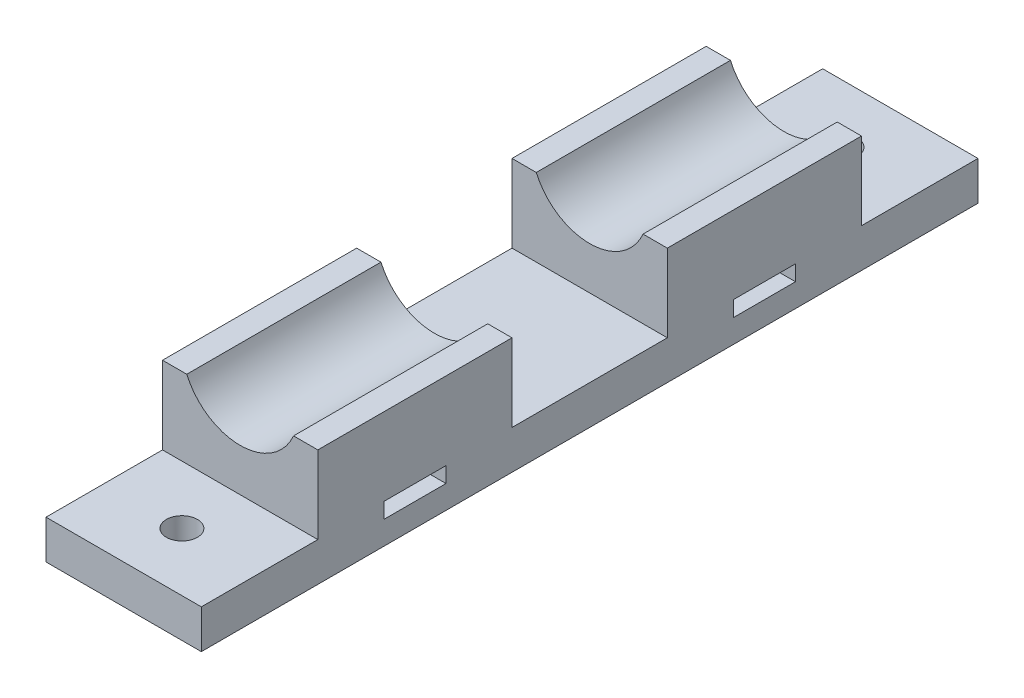
ISO-10303-21;
HEADER;
FILE_DESCRIPTION(('STEP AP214'),'2;1');
FILE_NAME('part.step','',(''),(''),'','','');
FILE_SCHEMA(('AUTOMOTIVE_DESIGN { 1 0 10303 214 1 1 1 1 }'));
ENDSEC;
DATA;
#1=APPLICATION_CONTEXT('core data for automotive mechanical design processes');
#2=APPLICATION_PROTOCOL_DEFINITION('international standard','automotive_design',2000,#1);
#3=PRODUCT_CONTEXT('',#1,'mechanical');
#4=PRODUCT('Part','Part','',(#3));
#5=PRODUCT_RELATED_PRODUCT_CATEGORY('part','',(#4));
#6=PRODUCT_DEFINITION_FORMATION('','',#4);
#7=PRODUCT_DEFINITION_CONTEXT('part definition',#1,'design');
#8=PRODUCT_DEFINITION('design','',#6,#7);
#9=PRODUCT_DEFINITION_SHAPE('','',#8);
#10=(LENGTH_UNIT() NAMED_UNIT(*) SI_UNIT(.MILLI.,.METRE.));
#11=(NAMED_UNIT(*) PLANE_ANGLE_UNIT() SI_UNIT($,.RADIAN.));
#12=(NAMED_UNIT(*) SI_UNIT($,.STERADIAN.) SOLID_ANGLE_UNIT());
#13=UNCERTAINTY_MEASURE_WITH_UNIT(LENGTH_MEASURE(1.E-05),#10,'distance_accuracy_value','');
#14=(GEOMETRIC_REPRESENTATION_CONTEXT(3) GLOBAL_UNCERTAINTY_ASSIGNED_CONTEXT((#13)) GLOBAL_UNIT_ASSIGNED_CONTEXT((#10,
#11,#12)) REPRESENTATION_CONTEXT('',''));
#15=CARTESIAN_POINT('',(0.,0.,0.));
#16=DIRECTION('',(0.,0.,1.));
#17=DIRECTION('',(1.,0.,0.));
#18=AXIS2_PLACEMENT_3D('',#15,#16,#17);
#19=CARTESIAN_POINT('',(10.,18.,35.));
#20=DIRECTION('',(0.,0.,-1.));
#21=DIRECTION('',(-1.,0.,0.));
#22=AXIS2_PLACEMENT_3D('',#19,#20,#21);
#23=PLANE('',#22);
#24=DIRECTION('',(-1.,0.,0.));
#25=VECTOR('',#24,1.);
#26=CARTESIAN_POINT('',(-10.,5.,35.));
#27=LINE('',#26,#25);
#28=CARTESIAN_POINT('',(10.,5.,35.));
#29=VERTEX_POINT('',#28);
#30=CARTESIAN_POINT('',(-10.,5.,35.));
#31=VERTEX_POINT('',#30);
#32=EDGE_CURVE('E47',#29,#31,#27,.T.);
#33=ORIENTED_EDGE('',*,*,#32,.F.);
#34=DIRECTION('',(0.,-1.,0.));
#35=VECTOR('',#34,1.);
#36=CARTESIAN_POINT('',(10.,18.,35.));
#37=LINE('',#36,#35);
#38=CARTESIAN_POINT('',(10.,15.,35.));
#39=VERTEX_POINT('',#38);
#40=EDGE_CURVE('E354',#39,#29,#37,.T.);
#41=ORIENTED_EDGE('',*,*,#40,.F.);
#42=DIRECTION('',(1.,0.,0.));
#43=VECTOR('',#42,1.);
#44=CARTESIAN_POINT('',(6.87386354243376,15.,35.));
#45=LINE('',#44,#43);
#46=CARTESIAN_POINT('',(6.87386354243376,15.,35.));
#47=VERTEX_POINT('',#46);
#48=EDGE_CURVE('E266',#47,#39,#45,.T.);
#49=ORIENTED_EDGE('',*,*,#48,.F.);
#50=CARTESIAN_POINT('',(0.,18.,35.));
#51=DIRECTION('',(0.,0.,1.));
#52=DIRECTION('',(1.,0.,0.));
#53=AXIS2_PLACEMENT_3D('',#50,#51,#52);
#54=CIRCLE('',#53,7.5);
#55=CARTESIAN_POINT('',(-6.87386354243376,15.,35.));
#56=VERTEX_POINT('',#55);
#57=EDGE_CURVE('E263',#56,#47,#54,.T.);
#58=ORIENTED_EDGE('',*,*,#57,.F.);
#59=DIRECTION('',(1.,0.,0.));
#60=VECTOR('',#59,1.);
#61=CARTESIAN_POINT('',(-10.,15.,35.));
#62=LINE('',#61,#60);
#63=CARTESIAN_POINT('',(-10.,15.,35.));
#64=VERTEX_POINT('',#63);
#65=EDGE_CURVE('E197',#64,#56,#62,.T.);
#66=ORIENTED_EDGE('',*,*,#65,.F.);
#67=DIRECTION('',(0.,-1.,0.));
#68=VECTOR('',#67,1.);
#69=CARTESIAN_POINT('',(-10.,18.,35.));
#70=LINE('',#69,#68);
#71=EDGE_CURVE('E193',#64,#31,#70,.T.);
#72=ORIENTED_EDGE('',*,*,#71,.T.);
#73=EDGE_LOOP('',(#33,#41,#49,#58,#66,#72));
#74=FACE_BOUND('',#73,.T.);
#75=ADVANCED_FACE('F33',(#74),#23,.F.);
#76=CARTESIAN_POINT('',(10.,18.,-35.));
#77=DIRECTION('',(0.,0.,1.));
#78=DIRECTION('',(1.,0.,0.));
#79=AXIS2_PLACEMENT_3D('',#76,#77,#78);
#80=PLANE('',#79);
#81=DIRECTION('',(1.,0.,0.));
#82=VECTOR('',#81,1.);
#83=CARTESIAN_POINT('',(-10.,5.,-35.));
#84=LINE('',#83,#82);
#85=CARTESIAN_POINT('',(-10.,5.,-35.));
#86=VERTEX_POINT('',#85);
#87=CARTESIAN_POINT('',(10.,5.,-35.));
#88=VERTEX_POINT('',#87);
#89=EDGE_CURVE('E55',#86,#88,#84,.T.);
#90=ORIENTED_EDGE('',*,*,#89,.F.);
#91=DIRECTION('',(0.,1.,0.));
#92=VECTOR('',#91,1.);
#93=CARTESIAN_POINT('',(-10.,18.,-35.));
#94=LINE('',#93,#92);
#95=CARTESIAN_POINT('',(-10.,15.,-35.));
#96=VERTEX_POINT('',#95);
#97=EDGE_CURVE('E370',#86,#96,#94,.T.);
#98=ORIENTED_EDGE('',*,*,#97,.T.);
#99=DIRECTION('',(-1.,0.,0.));
#100=VECTOR('',#99,1.);
#101=CARTESIAN_POINT('',(-10.,15.,-35.));
#102=LINE('',#101,#100);
#103=CARTESIAN_POINT('',(-6.87386354243376,15.,-35.));
#104=VERTEX_POINT('',#103);
#105=EDGE_CURVE('E261',#104,#96,#102,.T.);
#106=ORIENTED_EDGE('',*,*,#105,.F.);
#107=CARTESIAN_POINT('',(0.,18.,-35.));
#108=DIRECTION('',(0.,0.,1.));
#109=DIRECTION('',(1.,0.,0.));
#110=AXIS2_PLACEMENT_3D('',#107,#108,#109);
#111=CIRCLE('',#110,7.5);
#112=CARTESIAN_POINT('',(6.87386354243376,15.,-35.));
#113=VERTEX_POINT('',#112);
#114=EDGE_CURVE('E256',#113,#104,#111,.F.);
#115=ORIENTED_EDGE('',*,*,#114,.F.);
#116=DIRECTION('',(-1.,0.,0.));
#117=VECTOR('',#116,1.);
#118=CARTESIAN_POINT('',(6.87386354243376,15.,-35.));
#119=LINE('',#118,#117);
#120=CARTESIAN_POINT('',(10.,15.,-35.));
#121=VERTEX_POINT('',#120);
#122=EDGE_CURVE('E258',#121,#113,#119,.T.);
#123=ORIENTED_EDGE('',*,*,#122,.F.);
#124=DIRECTION('',(0.,1.,0.));
#125=VECTOR('',#124,1.);
#126=CARTESIAN_POINT('',(10.,18.,-35.));
#127=LINE('',#126,#125);
#128=EDGE_CURVE('E359',#88,#121,#127,.T.);
#129=ORIENTED_EDGE('',*,*,#128,.F.);
#130=EDGE_LOOP('',(#90,#98,#106,#115,#123,#129));
#131=FACE_BOUND('',#130,.T.);
#132=ADVANCED_FACE('F425',(#131),#80,.F.);
#133=CARTESIAN_POINT('',(10.,0.,0.));
#134=DIRECTION('',(1.,0.,0.));
#135=DIRECTION('',(0.,0.,-1.));
#136=AXIS2_PLACEMENT_3D('',#133,#134,#135);
#137=PLANE('',#136);
#138=DIRECTION('',(0.,0.,1.));
#139=VECTOR('',#138,1.);
#140=CARTESIAN_POINT('',(10.,15.,-56.3600093632938));
#141=LINE('',#140,#139);
#142=CARTESIAN_POINT('',(10.,15.,9.99999999999999));
#143=VERTEX_POINT('',#142);
#144=EDGE_CURVE('E271',#143,#39,#141,.T.);
#145=ORIENTED_EDGE('',*,*,#144,.T.);
#146=ORIENTED_EDGE('',*,*,#40,.T.);
#147=DIRECTION('',(0.,0.,-1.));
#148=VECTOR('',#147,1.);
#149=CARTESIAN_POINT('',(10.,5.,35.));
#150=LINE('',#149,#148);
#151=CARTESIAN_POINT('',(10.,4.99999999999999,50.));
#152=VERTEX_POINT('',#151);
#153=EDGE_CURVE('E217',#152,#29,#150,.T.);
#154=ORIENTED_EDGE('',*,*,#153,.F.);
#155=DIRECTION('',(0.,1.,0.));
#156=VECTOR('',#155,1.);
#157=CARTESIAN_POINT('',(10.,-25.,50.));
#158=LINE('',#157,#156);
#159=CARTESIAN_POINT('',(10.,0.,50.));
#160=VERTEX_POINT('',#159);
#161=EDGE_CURVE('E226',#160,#152,#158,.T.);
#162=ORIENTED_EDGE('',*,*,#161,.F.);
#163=DIRECTION('',(0.,0.,-1.));
#164=VECTOR('',#163,1.);
#165=CARTESIAN_POINT('',(10.,0.,35.));
#166=LINE('',#165,#164);
#167=CARTESIAN_POINT('',(10.,0.,-50.));
#168=VERTEX_POINT('',#167);
#169=EDGE_CURVE('E356',#160,#168,#166,.T.);
#170=ORIENTED_EDGE('',*,*,#169,.T.);
#171=DIRECTION('',(0.,1.,0.));
#172=VECTOR('',#171,1.);
#173=CARTESIAN_POINT('',(10.,-25.,-50.));
#174=LINE('',#173,#172);
#175=CARTESIAN_POINT('',(10.,5.00000000000001,-50.));
#176=VERTEX_POINT('',#175);
#177=EDGE_CURVE('E251',#168,#176,#174,.T.);
#178=ORIENTED_EDGE('',*,*,#177,.T.);
#179=DIRECTION('',(0.,0.,-1.));
#180=VECTOR('',#179,1.);
#181=CARTESIAN_POINT('',(10.,5.,-35.));
#182=LINE('',#181,#180);
#183=EDGE_CURVE('E245',#88,#176,#182,.T.);
#184=ORIENTED_EDGE('',*,*,#183,.F.);
#185=ORIENTED_EDGE('',*,*,#128,.T.);
#186=CARTESIAN_POINT('',(10.,15.,-9.99999999999999));
#187=VERTEX_POINT('',#186);
#188=EDGE_CURVE('E259',#121,#187,#141,.T.);
#189=ORIENTED_EDGE('',*,*,#188,.T.);
#190=DIRECTION('',(0.,-1.,0.));
#191=VECTOR('',#190,1.);
#192=CARTESIAN_POINT('',(10.,18.,-9.99999999999999));
#193=LINE('',#192,#191);
#194=CARTESIAN_POINT('',(10.,5.,-10.));
#195=VERTEX_POINT('',#194);
#196=EDGE_CURVE('E361',#187,#195,#193,.T.);
#197=ORIENTED_EDGE('',*,*,#196,.T.);
#198=DIRECTION('',(0.,0.,1.));
#199=VECTOR('',#198,1.);
#200=CARTESIAN_POINT('',(10.,5.,10.));
#201=LINE('',#200,#199);
#202=CARTESIAN_POINT('',(10.,5.,10.));
#203=VERTEX_POINT('',#202);
#204=EDGE_CURVE('E363',#195,#203,#201,.T.);
#205=ORIENTED_EDGE('',*,*,#204,.T.);
#206=DIRECTION('',(0.,1.,0.));
#207=VECTOR('',#206,1.);
#208=CARTESIAN_POINT('',(10.,18.,9.99999999999999));
#209=LINE('',#208,#207);
#210=EDGE_CURVE('E365',#203,#143,#209,.T.);
#211=ORIENTED_EDGE('',*,*,#210,.T.);
#212=EDGE_LOOP('',(#145,#146,#154,#162,#170,#178,#184,#185,#189,#197,#205,#211));
#213=FACE_BOUND('',#212,.T.);
#214=DIRECTION('',(0.,0.,-1.));
#215=VECTOR('',#214,1.);
#216=CARTESIAN_POINT('',(10.,3.,-18.5));
#217=LINE('',#216,#215);
#218=CARTESIAN_POINT('',(10.,3.,-18.5));
#219=VERTEX_POINT('',#218);
#220=CARTESIAN_POINT('',(10.,3.00000000000001,-26.5));
#221=VERTEX_POINT('',#220);
#222=EDGE_CURVE('E327',#219,#221,#217,.T.);
#223=ORIENTED_EDGE('',*,*,#222,.F.);
#224=DIRECTION('',(0.,-1.,0.));
#225=VECTOR('',#224,1.);
#226=CARTESIAN_POINT('',(10.,5.00000000000001,-18.5));
#227=LINE('',#226,#225);
#228=CARTESIAN_POINT('',(10.,5.00000000000001,-18.5));
#229=VERTEX_POINT('',#228);
#230=EDGE_CURVE('E325',#229,#219,#227,.T.);
#231=ORIENTED_EDGE('',*,*,#230,.F.);
#232=DIRECTION('',(0.,0.,1.));
#233=VECTOR('',#232,1.);
#234=CARTESIAN_POINT('',(10.,5.00000000000001,-18.5));
#235=LINE('',#234,#233);
#236=CARTESIAN_POINT('',(10.,5.00000000000001,-26.5));
#237=VERTEX_POINT('',#236);
#238=EDGE_CURVE('E333',#237,#229,#235,.T.);
#239=ORIENTED_EDGE('',*,*,#238,.F.);
#240=DIRECTION('',(0.,1.,0.));
#241=VECTOR('',#240,1.);
#242=CARTESIAN_POINT('',(10.,5.00000000000001,-26.5));
#243=LINE('',#242,#241);
#244=EDGE_CURVE('E330',#221,#237,#243,.T.);
#245=ORIENTED_EDGE('',*,*,#244,.F.);
#246=EDGE_LOOP('',(#223,#231,#239,#245));
#247=FACE_BOUND('',#246,.T.);
#248=DIRECTION('',(0.,0.,-1.));
#249=VECTOR('',#248,1.);
#250=CARTESIAN_POINT('',(10.,3.,18.5));
#251=LINE('',#250,#249);
#252=CARTESIAN_POINT('',(10.,3.,26.5));
#253=VERTEX_POINT('',#252);
#254=CARTESIAN_POINT('',(10.,3.,18.5));
#255=VERTEX_POINT('',#254);
#256=EDGE_CURVE('E296',#253,#255,#251,.T.);
#257=ORIENTED_EDGE('',*,*,#256,.F.);
#258=DIRECTION('',(0.,-1.,0.));
#259=VECTOR('',#258,1.);
#260=CARTESIAN_POINT('',(10.,5.,26.5));
#261=LINE('',#260,#259);
#262=CARTESIAN_POINT('',(10.,5.,26.5));
#263=VERTEX_POINT('',#262);
#264=EDGE_CURVE('E294',#263,#253,#261,.T.);
#265=ORIENTED_EDGE('',*,*,#264,.F.);
#266=DIRECTION('',(0.,0.,1.));
#267=VECTOR('',#266,1.);
#268=CARTESIAN_POINT('',(10.,5.,18.5));
#269=LINE('',#268,#267);
#270=CARTESIAN_POINT('',(10.,5.,18.5));
#271=VERTEX_POINT('',#270);
#272=EDGE_CURVE('E302',#271,#263,#269,.T.);
#273=ORIENTED_EDGE('',*,*,#272,.F.);
#274=DIRECTION('',(0.,1.,0.));
#275=VECTOR('',#274,1.);
#276=CARTESIAN_POINT('',(10.,5.,18.5));
#277=LINE('',#276,#275);
#278=EDGE_CURVE('E299',#255,#271,#277,.T.);
#279=ORIENTED_EDGE('',*,*,#278,.F.);
#280=EDGE_LOOP('',(#257,#265,#273,#279));
#281=FACE_BOUND('',#280,.T.);
#282=ADVANCED_FACE('F398',(#213,#247,#281),#137,.T.);
#283=CARTESIAN_POINT('',(-10.,0.,0.));
#284=DIRECTION('',(1.,0.,0.));
#285=DIRECTION('',(0.,0.,-1.));
#286=AXIS2_PLACEMENT_3D('',#283,#284,#285);
#287=PLANE('',#286);
#288=DIRECTION('',(0.,-1.,0.));
#289=VECTOR('',#288,1.);
#290=CARTESIAN_POINT('',(-10.,5.00000000000001,-18.5));
#291=LINE('',#290,#289);
#292=CARTESIAN_POINT('',(-10.,5.00000000000001,-18.5));
#293=VERTEX_POINT('',#292);
#294=CARTESIAN_POINT('',(-10.,3.,-18.5));
#295=VERTEX_POINT('',#294);
#296=EDGE_CURVE('E324',#293,#295,#291,.T.);
#297=ORIENTED_EDGE('',*,*,#296,.T.);
#298=DIRECTION('',(0.,0.,-1.));
#299=VECTOR('',#298,1.);
#300=CARTESIAN_POINT('',(-10.,3.,-18.5));
#301=LINE('',#300,#299);
#302=CARTESIAN_POINT('',(-10.,3.00000000000001,-26.5));
#303=VERTEX_POINT('',#302);
#304=EDGE_CURVE('E338',#295,#303,#301,.T.);
#305=ORIENTED_EDGE('',*,*,#304,.T.);
#306=DIRECTION('',(0.,1.,0.));
#307=VECTOR('',#306,1.);
#308=CARTESIAN_POINT('',(-10.,5.00000000000001,-26.5));
#309=LINE('',#308,#307);
#310=CARTESIAN_POINT('',(-10.,5.00000000000001,-26.5));
#311=VERTEX_POINT('',#310);
#312=EDGE_CURVE('E341',#303,#311,#309,.T.);
#313=ORIENTED_EDGE('',*,*,#312,.T.);
#314=DIRECTION('',(0.,0.,1.));
#315=VECTOR('',#314,1.);
#316=CARTESIAN_POINT('',(-10.,5.00000000000001,-18.5));
#317=LINE('',#316,#315);
#318=EDGE_CURVE('E328',#311,#293,#317,.T.);
#319=ORIENTED_EDGE('',*,*,#318,.T.);
#320=EDGE_LOOP('',(#297,#305,#313,#319));
#321=FACE_BOUND('',#320,.T.);
#322=ORIENTED_EDGE('',*,*,#71,.F.);
#323=DIRECTION('',(0.,0.,1.));
#324=VECTOR('',#323,1.);
#325=CARTESIAN_POINT('',(-10.,15.,-56.3600093632938));
#326=LINE('',#325,#324);
#327=CARTESIAN_POINT('',(-10.,15.,9.99999999999999));
#328=VERTEX_POINT('',#327);
#329=EDGE_CURVE('E268',#328,#64,#326,.T.);
#330=ORIENTED_EDGE('',*,*,#329,.F.);
#331=DIRECTION('',(0.,1.,0.));
#332=VECTOR('',#331,1.);
#333=CARTESIAN_POINT('',(-10.,18.,9.99999999999999));
#334=LINE('',#333,#332);
#335=CARTESIAN_POINT('',(-10.,5.,10.));
#336=VERTEX_POINT('',#335);
#337=EDGE_CURVE('E357',#336,#328,#334,.T.);
#338=ORIENTED_EDGE('',*,*,#337,.F.);
#339=DIRECTION('',(0.,0.,1.));
#340=VECTOR('',#339,1.);
#341=CARTESIAN_POINT('',(-10.,5.,10.));
#342=LINE('',#341,#340);
#343=CARTESIAN_POINT('',(-10.,5.,-10.));
#344=VERTEX_POINT('',#343);
#345=EDGE_CURVE('E374',#344,#336,#342,.T.);
#346=ORIENTED_EDGE('',*,*,#345,.F.);
#347=DIRECTION('',(0.,-1.,0.));
#348=VECTOR('',#347,1.);
#349=CARTESIAN_POINT('',(-10.,18.,-9.99999999999999));
#350=LINE('',#349,#348);
#351=CARTESIAN_POINT('',(-10.,15.,-10.));
#352=VERTEX_POINT('',#351);
#353=EDGE_CURVE('E372',#352,#344,#350,.T.);
#354=ORIENTED_EDGE('',*,*,#353,.F.);
#355=EDGE_CURVE('E280',#96,#352,#326,.T.);
#356=ORIENTED_EDGE('',*,*,#355,.F.);
#357=ORIENTED_EDGE('',*,*,#97,.F.);
#358=DIRECTION('',(0.,0.,1.));
#359=VECTOR('',#358,1.);
#360=CARTESIAN_POINT('',(-10.,5.,-35.));
#361=LINE('',#360,#359);
#362=CARTESIAN_POINT('',(-10.,5.00000000000001,-50.));
#363=VERTEX_POINT('',#362);
#364=EDGE_CURVE('E241',#363,#86,#361,.T.);
#365=ORIENTED_EDGE('',*,*,#364,.F.);
#366=DIRECTION('',(0.,1.,0.));
#367=VECTOR('',#366,1.);
#368=CARTESIAN_POINT('',(-10.,-25.,-50.));
#369=LINE('',#368,#367);
#370=CARTESIAN_POINT('',(-10.,0.,-50.));
#371=VERTEX_POINT('',#370);
#372=EDGE_CURVE('E238',#371,#363,#369,.T.);
#373=ORIENTED_EDGE('',*,*,#372,.F.);
#374=DIRECTION('',(0.,0.,-1.));
#375=VECTOR('',#374,1.);
#376=CARTESIAN_POINT('',(-10.,0.,35.));
#377=LINE('',#376,#375);
#378=CARTESIAN_POINT('',(-10.,0.,50.));
#379=VERTEX_POINT('',#378);
#380=EDGE_CURVE('E200',#379,#371,#377,.T.);
#381=ORIENTED_EDGE('',*,*,#380,.F.);
#382=DIRECTION('',(0.,1.,0.));
#383=VECTOR('',#382,1.);
#384=CARTESIAN_POINT('',(-10.,-25.,50.));
#385=LINE('',#384,#383);
#386=CARTESIAN_POINT('',(-10.,4.99999999999999,50.));
#387=VERTEX_POINT('',#386);
#388=EDGE_CURVE('E208',#379,#387,#385,.T.);
#389=ORIENTED_EDGE('',*,*,#388,.T.);
#390=DIRECTION('',(0.,0.,1.));
#391=VECTOR('',#390,1.);
#392=CARTESIAN_POINT('',(-10.,5.,35.));
#393=LINE('',#392,#391);
#394=EDGE_CURVE('E204',#31,#387,#393,.T.);
#395=ORIENTED_EDGE('',*,*,#394,.F.);
#396=EDGE_LOOP('',(#322,#330,#338,#346,#354,#356,#357,#365,#373,#381,#389,#395));
#397=FACE_BOUND('',#396,.T.);
#398=DIRECTION('',(0.,-1.,0.));
#399=VECTOR('',#398,1.);
#400=CARTESIAN_POINT('',(-10.,5.,26.5));
#401=LINE('',#400,#399);
#402=CARTESIAN_POINT('',(-10.,5.,26.5));
#403=VERTEX_POINT('',#402);
#404=CARTESIAN_POINT('',(-10.,3.,26.5));
#405=VERTEX_POINT('',#404);
#406=EDGE_CURVE('E293',#403,#405,#401,.T.);
#407=ORIENTED_EDGE('',*,*,#406,.T.);
#408=DIRECTION('',(0.,0.,-1.));
#409=VECTOR('',#408,1.);
#410=CARTESIAN_POINT('',(-10.,3.,18.5));
#411=LINE('',#410,#409);
#412=CARTESIAN_POINT('',(-10.,3.,18.5));
#413=VERTEX_POINT('',#412);
#414=EDGE_CURVE('E307',#405,#413,#411,.T.);
#415=ORIENTED_EDGE('',*,*,#414,.T.);
#416=DIRECTION('',(0.,1.,0.));
#417=VECTOR('',#416,1.);
#418=CARTESIAN_POINT('',(-10.,5.,18.5));
#419=LINE('',#418,#417);
#420=CARTESIAN_POINT('',(-10.,5.,18.5));
#421=VERTEX_POINT('',#420);
#422=EDGE_CURVE('E310',#413,#421,#419,.T.);
#423=ORIENTED_EDGE('',*,*,#422,.T.);
#424=DIRECTION('',(0.,0.,1.));
#425=VECTOR('',#424,1.);
#426=CARTESIAN_POINT('',(-10.,5.,18.5));
#427=LINE('',#426,#425);
#428=EDGE_CURVE('E297',#421,#403,#427,.T.);
#429=ORIENTED_EDGE('',*,*,#428,.T.);
#430=EDGE_LOOP('',(#407,#415,#423,#429));
#431=FACE_BOUND('',#430,.T.);
#432=ADVANCED_FACE('F205',(#321,#397,#431),#287,.F.);
#433=CARTESIAN_POINT('',(10.,0.,35.));
#434=DIRECTION('',(0.,1.,0.));
#435=DIRECTION('',(0.,0.,1.));
#436=AXIS2_PLACEMENT_3D('',#433,#434,#435);
#437=PLANE('',#436);
#438=ORIENTED_EDGE('',*,*,#380,.T.);
#439=DIRECTION('',(1.,0.,0.));
#440=VECTOR('',#439,1.);
#441=CARTESIAN_POINT('',(-10.,0.,-50.));
#442=LINE('',#441,#440);
#443=EDGE_CURVE('E234',#371,#168,#442,.T.);
#444=ORIENTED_EDGE('',*,*,#443,.T.);
#445=ORIENTED_EDGE('',*,*,#169,.F.);
#446=DIRECTION('',(-1.,0.,0.));
#447=VECTOR('',#446,1.);
#448=CARTESIAN_POINT('',(-10.,0.,50.));
#449=LINE('',#448,#447);
#450=EDGE_CURVE('E228',#160,#379,#449,.T.);
#451=ORIENTED_EDGE('',*,*,#450,.T.);
#452=EDGE_LOOP('',(#438,#444,#445,#451));
#453=FACE_BOUND('',#452,.T.);
#454=CARTESIAN_POINT('',(0.,0.,-42.5));
#455=DIRECTION('',(0.,1.,0.));
#456=DIRECTION('',(0.,0.,1.));
#457=AXIS2_PLACEMENT_3D('',#454,#455,#456);
#458=CIRCLE('',#457,2.);
#459=CARTESIAN_POINT('',(0.,0.,-40.5));
#460=VERTEX_POINT('',#459);
#461=EDGE_CURVE('E237',#460,#460,#458,.F.);
#462=ORIENTED_EDGE('',*,*,#461,.F.);
#463=EDGE_LOOP('',(#462));
#464=FACE_BOUND('',#463,.T.);
#465=CARTESIAN_POINT('',(0.,0.,42.5));
#466=DIRECTION('',(0.,1.,0.));
#467=DIRECTION('',(0.,0.,1.));
#468=AXIS2_PLACEMENT_3D('',#465,#466,#467);
#469=CIRCLE('',#468,2.);
#470=CARTESIAN_POINT('',(0.,0.,44.5));
#471=VERTEX_POINT('',#470);
#472=EDGE_CURVE('E230',#471,#471,#469,.F.);
#473=ORIENTED_EDGE('',*,*,#472,.F.);
#474=EDGE_LOOP('',(#473));
#475=FACE_BOUND('',#474,.T.);
#476=ADVANCED_FACE('F437',(#453,#464,#475),#437,.F.);
#477=CARTESIAN_POINT('',(10.,18.,-9.99999999999999));
#478=DIRECTION('',(0.,0.,-1.));
#479=DIRECTION('',(0.,1.,0.));
#480=AXIS2_PLACEMENT_3D('',#477,#478,#479);
#481=PLANE('',#480);
#482=ORIENTED_EDGE('',*,*,#196,.F.);
#483=DIRECTION('',(-1.,0.,0.));
#484=VECTOR('',#483,1.);
#485=CARTESIAN_POINT('',(10.,15.,-10.));
#486=LINE('',#485,#484);
#487=CARTESIAN_POINT('',(6.87386354243376,15.,-9.99999999999999));
#488=VERTEX_POINT('',#487);
#489=EDGE_CURVE('E290',#187,#488,#486,.T.);
#490=ORIENTED_EDGE('',*,*,#489,.T.);
#491=CARTESIAN_POINT('',(0.,18.,-9.99999999999999));
#492=DIRECTION('',(0.,0.,-1.));
#493=DIRECTION('',(0.,1.,0.));
#494=AXIS2_PLACEMENT_3D('',#491,#492,#493);
#495=CIRCLE('',#494,7.5);
#496=CARTESIAN_POINT('',(-6.87386354243376,15.,-9.99999999999999));
#497=VERTEX_POINT('',#496);
#498=EDGE_CURVE('E287',#488,#497,#495,.T.);
#499=ORIENTED_EDGE('',*,*,#498,.T.);
#500=DIRECTION('',(-1.,0.,0.));
#501=VECTOR('',#500,1.);
#502=CARTESIAN_POINT('',(10.,15.,-10.));
#503=LINE('',#502,#501);
#504=EDGE_CURVE('E284',#497,#352,#503,.T.);
#505=ORIENTED_EDGE('',*,*,#504,.T.);
#506=ORIENTED_EDGE('',*,*,#353,.T.);
#507=DIRECTION('',(-1.,0.,0.));
#508=VECTOR('',#507,1.);
#509=CARTESIAN_POINT('',(10.,5.,-10.));
#510=LINE('',#509,#508);
#511=EDGE_CURVE('E380',#195,#344,#510,.T.);
#512=ORIENTED_EDGE('',*,*,#511,.F.);
#513=EDGE_LOOP('',(#482,#490,#499,#505,#506,#512));
#514=FACE_BOUND('',#513,.T.);
#515=ADVANCED_FACE('F435',(#514),#481,.F.);
#516=CARTESIAN_POINT('',(10.,5.,10.));
#517=DIRECTION('',(0.,-1.,0.));
#518=DIRECTION('',(0.,0.,-1.));
#519=AXIS2_PLACEMENT_3D('',#516,#517,#518);
#520=PLANE('',#519);
#521=ORIENTED_EDGE('',*,*,#345,.T.);
#522=DIRECTION('',(-1.,0.,0.));
#523=VECTOR('',#522,1.);
#524=CARTESIAN_POINT('',(10.,5.,10.));
#525=LINE('',#524,#523);
#526=EDGE_CURVE('E367',#203,#336,#525,.T.);
#527=ORIENTED_EDGE('',*,*,#526,.F.);
#528=ORIENTED_EDGE('',*,*,#204,.F.);
#529=ORIENTED_EDGE('',*,*,#511,.T.);
#530=EDGE_LOOP('',(#521,#527,#528,#529));
#531=FACE_BOUND('',#530,.T.);
#532=ADVANCED_FACE('F444',(#531),#520,.F.);
#533=CARTESIAN_POINT('',(10.,18.,9.99999999999999));
#534=DIRECTION('',(0.,0.,1.));
#535=DIRECTION('',(0.,-1.,0.));
#536=AXIS2_PLACEMENT_3D('',#533,#534,#535);
#537=PLANE('',#536);
#538=CARTESIAN_POINT('',(0.,18.,9.99999999999999));
#539=DIRECTION('',(0.,0.,1.));
#540=DIRECTION('',(0.,-1.,0.));
#541=AXIS2_PLACEMENT_3D('',#538,#539,#540);
#542=CIRCLE('',#541,7.5);
#543=CARTESIAN_POINT('',(-6.87386354243376,15.,10.));
#544=VERTEX_POINT('',#543);
#545=CARTESIAN_POINT('',(6.87386354243376,15.,9.99999999999999));
#546=VERTEX_POINT('',#545);
#547=EDGE_CURVE('E40',#544,#546,#542,.T.);
#548=ORIENTED_EDGE('',*,*,#547,.T.);
#549=DIRECTION('',(1.,0.,0.));
#550=VECTOR('',#549,1.);
#551=CARTESIAN_POINT('',(10.,15.,10.));
#552=LINE('',#551,#550);
#553=EDGE_CURVE('E11',#546,#143,#552,.T.);
#554=ORIENTED_EDGE('',*,*,#553,.T.);
#555=ORIENTED_EDGE('',*,*,#210,.F.);
#556=ORIENTED_EDGE('',*,*,#526,.T.);
#557=ORIENTED_EDGE('',*,*,#337,.T.);
#558=DIRECTION('',(1.,0.,0.));
#559=VECTOR('',#558,1.);
#560=CARTESIAN_POINT('',(10.,15.,10.));
#561=LINE('',#560,#559);
#562=EDGE_CURVE('E383',#328,#544,#561,.T.);
#563=ORIENTED_EDGE('',*,*,#562,.T.);
#564=EDGE_LOOP('',(#548,#554,#555,#556,#557,#563));
#565=FACE_BOUND('',#564,.T.);
#566=ADVANCED_FACE('F388',(#565),#537,.F.);
#567=CARTESIAN_POINT('',(10.,5.00000000000001,-18.5));
#568=DIRECTION('',(0.,0.,-1.));
#569=DIRECTION('',(-1.,0.,0.));
#570=AXIS2_PLACEMENT_3D('',#567,#568,#569);
#571=PLANE('',#570);
#572=ORIENTED_EDGE('',*,*,#296,.F.);
#573=DIRECTION('',(-1.,0.,0.));
#574=VECTOR('',#573,1.);
#575=CARTESIAN_POINT('',(10.,5.00000000000001,-18.5));
#576=LINE('',#575,#574);
#577=EDGE_CURVE('E335',#229,#293,#576,.T.);
#578=ORIENTED_EDGE('',*,*,#577,.F.);
#579=ORIENTED_EDGE('',*,*,#230,.T.);
#580=DIRECTION('',(-1.,0.,0.));
#581=VECTOR('',#580,1.);
#582=CARTESIAN_POINT('',(10.,3.,-18.5));
#583=LINE('',#582,#581);
#584=EDGE_CURVE('E201',#219,#295,#583,.T.);
#585=ORIENTED_EDGE('',*,*,#584,.T.);
#586=EDGE_LOOP('',(#572,#578,#579,#585));
#587=FACE_BOUND('',#586,.T.);
#588=ADVANCED_FACE('F501',(#587),#571,.T.);
#589=CARTESIAN_POINT('',(10.,3.,-18.5));
#590=DIRECTION('',(0.,1.,0.));
#591=DIRECTION('',(0.,0.,1.));
#592=AXIS2_PLACEMENT_3D('',#589,#590,#591);
#593=PLANE('',#592);
#594=ORIENTED_EDGE('',*,*,#304,.F.);
#595=ORIENTED_EDGE('',*,*,#584,.F.);
#596=ORIENTED_EDGE('',*,*,#222,.T.);
#597=DIRECTION('',(-1.,0.,0.));
#598=VECTOR('',#597,1.);
#599=CARTESIAN_POINT('',(10.,3.00000000000001,-26.5));
#600=LINE('',#599,#598);
#601=EDGE_CURVE('E350',#221,#303,#600,.T.);
#602=ORIENTED_EDGE('',*,*,#601,.T.);
#603=EDGE_LOOP('',(#594,#595,#596,#602));
#604=FACE_BOUND('',#603,.T.);
#605=ADVANCED_FACE('F506',(#604),#593,.T.);
#606=CARTESIAN_POINT('',(10.,5.00000000000001,-26.5));
#607=DIRECTION('',(0.,0.,1.));
#608=DIRECTION('',(1.,0.,0.));
#609=AXIS2_PLACEMENT_3D('',#606,#607,#608);
#610=PLANE('',#609);
#611=ORIENTED_EDGE('',*,*,#312,.F.);
#612=ORIENTED_EDGE('',*,*,#601,.F.);
#613=ORIENTED_EDGE('',*,*,#244,.T.);
#614=DIRECTION('',(-1.,0.,0.));
#615=VECTOR('',#614,1.);
#616=CARTESIAN_POINT('',(10.,5.00000000000001,-26.5));
#617=LINE('',#616,#615);
#618=EDGE_CURVE('E348',#237,#311,#617,.T.);
#619=ORIENTED_EDGE('',*,*,#618,.T.);
#620=EDGE_LOOP('',(#611,#612,#613,#619));
#621=FACE_BOUND('',#620,.T.);
#622=ADVANCED_FACE('F510',(#621),#610,.T.);
#623=CARTESIAN_POINT('',(10.,5.00000000000001,-18.5));
#624=DIRECTION('',(0.,-1.,0.));
#625=DIRECTION('',(0.,0.,-1.));
#626=AXIS2_PLACEMENT_3D('',#623,#624,#625);
#627=PLANE('',#626);
#628=ORIENTED_EDGE('',*,*,#318,.F.);
#629=ORIENTED_EDGE('',*,*,#618,.F.);
#630=ORIENTED_EDGE('',*,*,#238,.T.);
#631=ORIENTED_EDGE('',*,*,#577,.T.);
#632=EDGE_LOOP('',(#628,#629,#630,#631));
#633=FACE_BOUND('',#632,.T.);
#634=ADVANCED_FACE('F514',(#633),#627,.T.);
#635=CARTESIAN_POINT('',(10.,5.,26.5));
#636=DIRECTION('',(0.,0.,-1.));
#637=DIRECTION('',(-1.,0.,0.));
#638=AXIS2_PLACEMENT_3D('',#635,#636,#637);
#639=PLANE('',#638);
#640=ORIENTED_EDGE('',*,*,#406,.F.);
#641=DIRECTION('',(-1.,0.,0.));
#642=VECTOR('',#641,1.);
#643=CARTESIAN_POINT('',(10.,5.,26.5));
#644=LINE('',#643,#642);
#645=EDGE_CURVE('E304',#263,#403,#644,.T.);
#646=ORIENTED_EDGE('',*,*,#645,.F.);
#647=ORIENTED_EDGE('',*,*,#264,.T.);
#648=DIRECTION('',(-1.,0.,0.));
#649=VECTOR('',#648,1.);
#650=CARTESIAN_POINT('',(10.,3.,26.5));
#651=LINE('',#650,#649);
#652=EDGE_CURVE('E321',#253,#405,#651,.T.);
#653=ORIENTED_EDGE('',*,*,#652,.T.);
#654=EDGE_LOOP('',(#640,#646,#647,#653));
#655=FACE_BOUND('',#654,.T.);
#656=ADVANCED_FACE('F518',(#655),#639,.T.);
#657=CARTESIAN_POINT('',(10.,3.,18.5));
#658=DIRECTION('',(0.,1.,0.));
#659=DIRECTION('',(0.,0.,1.));
#660=AXIS2_PLACEMENT_3D('',#657,#658,#659);
#661=PLANE('',#660);
#662=ORIENTED_EDGE('',*,*,#414,.F.);
#663=ORIENTED_EDGE('',*,*,#652,.F.);
#664=ORIENTED_EDGE('',*,*,#256,.T.);
#665=DIRECTION('',(-1.,0.,0.));
#666=VECTOR('',#665,1.);
#667=CARTESIAN_POINT('',(10.,3.,18.5));
#668=LINE('',#667,#666);
#669=EDGE_CURVE('E319',#255,#413,#668,.T.);
#670=ORIENTED_EDGE('',*,*,#669,.T.);
#671=EDGE_LOOP('',(#662,#663,#664,#670));
#672=FACE_BOUND('',#671,.T.);
#673=ADVANCED_FACE('F522',(#672),#661,.T.);
#674=CARTESIAN_POINT('',(10.,5.,18.5));
#675=DIRECTION('',(0.,0.,1.));
#676=DIRECTION('',(1.,0.,0.));
#677=AXIS2_PLACEMENT_3D('',#674,#675,#676);
#678=PLANE('',#677);
#679=ORIENTED_EDGE('',*,*,#422,.F.);
#680=ORIENTED_EDGE('',*,*,#669,.F.);
#681=ORIENTED_EDGE('',*,*,#278,.T.);
#682=DIRECTION('',(-1.,0.,0.));
#683=VECTOR('',#682,1.);
#684=CARTESIAN_POINT('',(10.,5.,18.5));
#685=LINE('',#684,#683);
#686=EDGE_CURVE('E317',#271,#421,#685,.T.);
#687=ORIENTED_EDGE('',*,*,#686,.T.);
#688=EDGE_LOOP('',(#679,#680,#681,#687));
#689=FACE_BOUND('',#688,.T.);
#690=ADVANCED_FACE('F418',(#689),#678,.T.);
#691=CARTESIAN_POINT('',(10.,5.,18.5));
#692=DIRECTION('',(0.,-1.,0.));
#693=DIRECTION('',(0.,0.,-1.));
#694=AXIS2_PLACEMENT_3D('',#691,#692,#693);
#695=PLANE('',#694);
#696=ORIENTED_EDGE('',*,*,#428,.F.);
#697=ORIENTED_EDGE('',*,*,#686,.F.);
#698=ORIENTED_EDGE('',*,*,#272,.T.);
#699=ORIENTED_EDGE('',*,*,#645,.T.);
#700=EDGE_LOOP('',(#696,#697,#698,#699));
#701=FACE_BOUND('',#700,.T.);
#702=ADVANCED_FACE('F409',(#701),#695,.T.);
#703=CARTESIAN_POINT('',(-10.,15.,-56.3600093632938));
#704=DIRECTION('',(0.,-1.,0.));
#705=DIRECTION('',(0.,0.,-1.));
#706=AXIS2_PLACEMENT_3D('',#703,#704,#705);
#707=PLANE('',#706);
#708=ORIENTED_EDGE('',*,*,#329,.T.);
#709=ORIENTED_EDGE('',*,*,#65,.T.);
#710=DIRECTION('',(0.,0.,1.));
#711=VECTOR('',#710,1.);
#712=CARTESIAN_POINT('',(-6.87386354243376,15.,-56.3600093632938));
#713=LINE('',#712,#711);
#714=EDGE_CURVE('E279',#544,#56,#713,.T.);
#715=ORIENTED_EDGE('',*,*,#714,.F.);
#716=ORIENTED_EDGE('',*,*,#562,.F.);
#717=EDGE_LOOP('',(#708,#709,#715,#716));
#718=FACE_BOUND('',#717,.T.);
#719=ADVANCED_FACE('F407',(#718),#707,.F.);
#720=CARTESIAN_POINT('',(0.,18.,-56.3600093632938));
#721=DIRECTION('',(0.,0.,1.));
#722=DIRECTION('',(1.,0.,0.));
#723=AXIS2_PLACEMENT_3D('',#720,#721,#722);
#724=CYLINDRICAL_SURFACE('',#723,7.5);
#725=ORIENTED_EDGE('',*,*,#714,.T.);
#726=ORIENTED_EDGE('',*,*,#57,.T.);
#727=DIRECTION('',(0.,0.,1.));
#728=VECTOR('',#727,1.);
#729=CARTESIAN_POINT('',(6.87386354243376,15.,-56.3600093632938));
#730=LINE('',#729,#728);
#731=EDGE_CURVE('E275',#546,#47,#730,.T.);
#732=ORIENTED_EDGE('',*,*,#731,.F.);
#733=ORIENTED_EDGE('',*,*,#547,.F.);
#734=EDGE_LOOP('',(#725,#726,#732,#733));
#735=FACE_BOUND('',#734,.T.);
#736=ADVANCED_FACE('F392',(#735),#724,.F.);
#737=CARTESIAN_POINT('',(6.87386354243376,15.,-56.3600093632938));
#738=DIRECTION('',(0.,-1.,0.));
#739=DIRECTION('',(0.,0.,-1.));
#740=AXIS2_PLACEMENT_3D('',#737,#738,#739);
#741=PLANE('',#740);
#742=ORIENTED_EDGE('',*,*,#731,.T.);
#743=ORIENTED_EDGE('',*,*,#48,.T.);
#744=ORIENTED_EDGE('',*,*,#144,.F.);
#745=ORIENTED_EDGE('',*,*,#553,.F.);
#746=EDGE_LOOP('',(#742,#743,#744,#745));
#747=FACE_BOUND('',#746,.T.);
#748=ADVANCED_FACE('F395',(#747),#741,.F.);
#749=ORIENTED_EDGE('',*,*,#188,.F.);
#750=ORIENTED_EDGE('',*,*,#122,.T.);
#751=EDGE_CURVE('E272',#113,#488,#730,.T.);
#752=ORIENTED_EDGE('',*,*,#751,.T.);
#753=ORIENTED_EDGE('',*,*,#489,.F.);
#754=EDGE_LOOP('',(#749,#750,#752,#753));
#755=FACE_BOUND('',#754,.T.);
#756=ADVANCED_FACE('F481',(#755),#741,.F.);
#757=ORIENTED_EDGE('',*,*,#751,.F.);
#758=ORIENTED_EDGE('',*,*,#114,.T.);
#759=EDGE_CURVE('E276',#104,#497,#713,.T.);
#760=ORIENTED_EDGE('',*,*,#759,.T.);
#761=ORIENTED_EDGE('',*,*,#498,.F.);
#762=EDGE_LOOP('',(#757,#758,#760,#761));
#763=FACE_BOUND('',#762,.T.);
#764=ADVANCED_FACE('F417',(#763),#724,.F.);
#765=ORIENTED_EDGE('',*,*,#759,.F.);
#766=ORIENTED_EDGE('',*,*,#105,.T.);
#767=ORIENTED_EDGE('',*,*,#355,.T.);
#768=ORIENTED_EDGE('',*,*,#504,.F.);
#769=EDGE_LOOP('',(#765,#766,#767,#768));
#770=FACE_BOUND('',#769,.T.);
#771=ADVANCED_FACE('F411',(#770),#707,.F.);
#772=CARTESIAN_POINT('',(-10.,-25.,-50.));
#773=DIRECTION('',(0.,0.,-1.));
#774=DIRECTION('',(0.,1.,0.));
#775=AXIS2_PLACEMENT_3D('',#772,#773,#774);
#776=PLANE('',#775);
#777=ORIENTED_EDGE('',*,*,#443,.F.);
#778=ORIENTED_EDGE('',*,*,#372,.T.);
#779=DIRECTION('',(-1.,0.,0.));
#780=VECTOR('',#779,1.);
#781=CARTESIAN_POINT('',(-10.,5.00000000000001,-50.));
#782=LINE('',#781,#780);
#783=EDGE_CURVE('E248',#176,#363,#782,.T.);
#784=ORIENTED_EDGE('',*,*,#783,.F.);
#785=ORIENTED_EDGE('',*,*,#177,.F.);
#786=EDGE_LOOP('',(#777,#778,#784,#785));
#787=FACE_BOUND('',#786,.T.);
#788=ADVANCED_FACE('F422',(#787),#776,.T.);
#789=CARTESIAN_POINT('',(0.,5.,0.));
#790=DIRECTION('',(0.,-1.,0.));
#791=DIRECTION('',(0.,0.,-1.));
#792=AXIS2_PLACEMENT_3D('',#789,#790,#791);
#793=PLANE('',#792);
#794=CARTESIAN_POINT('',(0.,5.00000000000001,-42.5));
#795=DIRECTION('',(0.,1.,0.));
#796=DIRECTION('',(0.,0.,1.));
#797=AXIS2_PLACEMENT_3D('',#794,#795,#796);
#798=CIRCLE('',#797,2.);
#799=CARTESIAN_POINT('',(0.,5.00000000000001,-40.5));
#800=VERTEX_POINT('',#799);
#801=EDGE_CURVE('E233',#800,#800,#798,.T.);
#802=ORIENTED_EDGE('',*,*,#801,.F.);
#803=EDGE_LOOP('',(#802));
#804=FACE_BOUND('',#803,.T.);
#805=ORIENTED_EDGE('',*,*,#364,.T.);
#806=ORIENTED_EDGE('',*,*,#89,.T.);
#807=ORIENTED_EDGE('',*,*,#183,.T.);
#808=ORIENTED_EDGE('',*,*,#783,.T.);
#809=EDGE_LOOP('',(#805,#806,#807,#808));
#810=FACE_BOUND('',#809,.T.);
#811=ADVANCED_FACE('F473',(#804,#810),#793,.F.);
#812=CARTESIAN_POINT('',(0.,-25.,-42.5));
#813=DIRECTION('',(0.,1.,0.));
#814=DIRECTION('',(0.,0.,1.));
#815=AXIS2_PLACEMENT_3D('',#812,#813,#814);
#816=CYLINDRICAL_SURFACE('',#815,2.);
#817=ORIENTED_EDGE('',*,*,#461,.T.);
#818=EDGE_LOOP('',(#817));
#819=FACE_BOUND('',#818,.T.);
#820=ORIENTED_EDGE('',*,*,#801,.T.);
#821=EDGE_LOOP('',(#820));
#822=FACE_BOUND('',#821,.T.);
#823=ADVANCED_FACE('F467',(#819,#822),#816,.F.);
#824=CARTESIAN_POINT('',(-10.,-25.,50.));
#825=DIRECTION('',(0.,0.,1.));
#826=DIRECTION('',(0.,-1.,0.));
#827=AXIS2_PLACEMENT_3D('',#824,#825,#826);
#828=PLANE('',#827);
#829=ORIENTED_EDGE('',*,*,#450,.F.);
#830=ORIENTED_EDGE('',*,*,#161,.T.);
#831=DIRECTION('',(1.,0.,0.));
#832=VECTOR('',#831,1.);
#833=CARTESIAN_POINT('',(-10.,4.99999999999999,50.));
#834=LINE('',#833,#832);
#835=EDGE_CURVE('E212',#387,#152,#834,.T.);
#836=ORIENTED_EDGE('',*,*,#835,.F.);
#837=ORIENTED_EDGE('',*,*,#388,.F.);
#838=EDGE_LOOP('',(#829,#830,#836,#837));
#839=FACE_BOUND('',#838,.T.);
#840=ADVANCED_FACE('F462',(#839),#828,.T.);
#841=CARTESIAN_POINT('',(0.,5.,0.));
#842=DIRECTION('',(0.,-1.,0.));
#843=DIRECTION('',(0.,0.,-1.));
#844=AXIS2_PLACEMENT_3D('',#841,#842,#843);
#845=PLANE('',#844);
#846=CARTESIAN_POINT('',(0.,4.99999999999999,42.5));
#847=DIRECTION('',(0.,1.,0.));
#848=DIRECTION('',(0.,0.,-1.));
#849=AXIS2_PLACEMENT_3D('',#846,#847,#848);
#850=CIRCLE('',#849,2.);
#851=CARTESIAN_POINT('',(0.,4.99999999999999,40.5));
#852=VERTEX_POINT('',#851);
#853=EDGE_CURVE('E218',#852,#852,#850,.T.);
#854=ORIENTED_EDGE('',*,*,#853,.F.);
#855=EDGE_LOOP('',(#854));
#856=FACE_BOUND('',#855,.T.);
#857=ORIENTED_EDGE('',*,*,#32,.T.);
#858=ORIENTED_EDGE('',*,*,#394,.T.);
#859=ORIENTED_EDGE('',*,*,#835,.T.);
#860=ORIENTED_EDGE('',*,*,#153,.T.);
#861=EDGE_LOOP('',(#857,#858,#859,#860));
#862=FACE_BOUND('',#861,.T.);
#863=ADVANCED_FACE('F215',(#856,#862),#845,.F.);
#864=CARTESIAN_POINT('',(0.,-25.,42.5));
#865=DIRECTION('',(0.,1.,0.));
#866=DIRECTION('',(0.,0.,1.));
#867=AXIS2_PLACEMENT_3D('',#864,#865,#866);
#868=CYLINDRICAL_SURFACE('',#867,2.);
#869=ORIENTED_EDGE('',*,*,#472,.T.);
#870=EDGE_LOOP('',(#869));
#871=FACE_BOUND('',#870,.T.);
#872=ORIENTED_EDGE('',*,*,#853,.T.);
#873=EDGE_LOOP('',(#872));
#874=FACE_BOUND('',#873,.T.);
#875=ADVANCED_FACE('F455',(#871,#874),#868,.F.);
#876=CLOSED_SHELL('',(#75,#132,#282,#432,#476,#515,#532,#566,#588,#605,#622,#634,#656,#673,#690,
#702,#719,#736,#748,#756,#764,#771,#788,#811,#823,#840,#863,#875));
#877=MANIFOLD_SOLID_BREP('B2',#876);
#878=ADVANCED_BREP_SHAPE_REPRESENTATION('',(#18,#877),#14);
#879=SHAPE_DEFINITION_REPRESENTATION(#9,#878);
ENDSEC;
END-ISO-10303-21;
